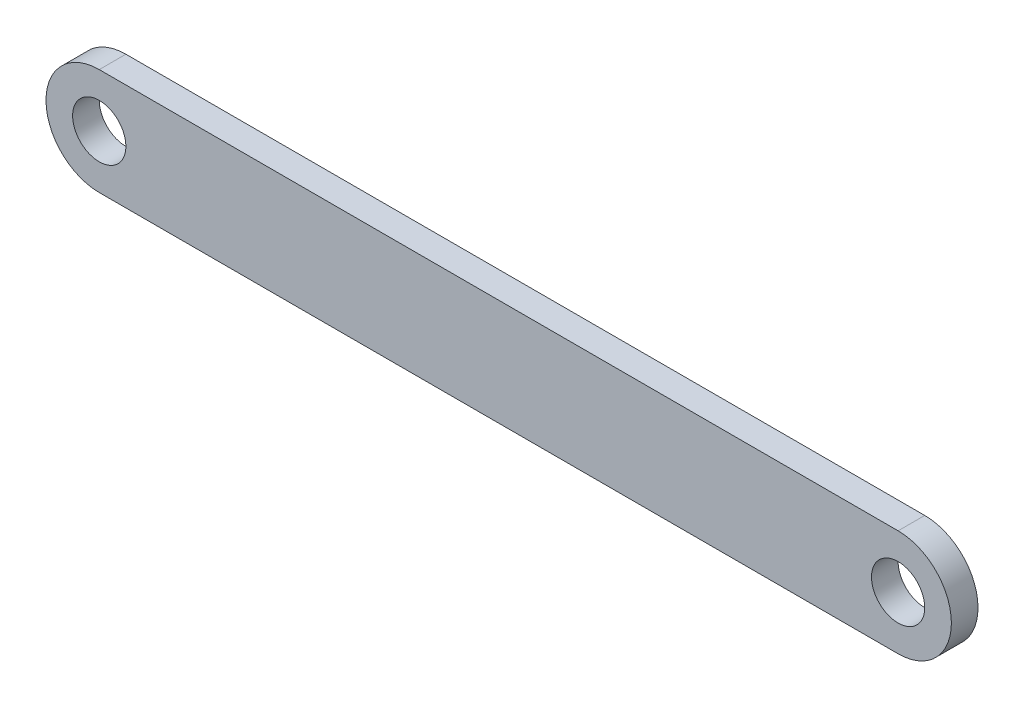
ISO-10303-21;
HEADER;
FILE_DESCRIPTION(('STEP AP214'),'2;1');
FILE_NAME('part.step','',(''),(''),'','','');
FILE_SCHEMA(('AUTOMOTIVE_DESIGN { 1 0 10303 214 1 1 1 1 }'));
ENDSEC;
DATA;
#1=APPLICATION_CONTEXT('core data for automotive mechanical design processes');
#2=APPLICATION_PROTOCOL_DEFINITION('international standard','automotive_design',2000,#1);
#3=PRODUCT_CONTEXT('',#1,'mechanical');
#4=PRODUCT('Part','Part','',(#3));
#5=PRODUCT_RELATED_PRODUCT_CATEGORY('part','',(#4));
#6=PRODUCT_DEFINITION_FORMATION('','',#4);
#7=PRODUCT_DEFINITION_CONTEXT('part definition',#1,'design');
#8=PRODUCT_DEFINITION('design','',#6,#7);
#9=PRODUCT_DEFINITION_SHAPE('','',#8);
#10=(LENGTH_UNIT() NAMED_UNIT(*) SI_UNIT(.MILLI.,.METRE.));
#11=(NAMED_UNIT(*) PLANE_ANGLE_UNIT() SI_UNIT($,.RADIAN.));
#12=(NAMED_UNIT(*) SI_UNIT($,.STERADIAN.) SOLID_ANGLE_UNIT());
#13=UNCERTAINTY_MEASURE_WITH_UNIT(LENGTH_MEASURE(1.E-05),#10,'distance_accuracy_value','');
#14=(GEOMETRIC_REPRESENTATION_CONTEXT(3) GLOBAL_UNCERTAINTY_ASSIGNED_CONTEXT((#13)) GLOBAL_UNIT_ASSIGNED_CONTEXT((#10,
#11,#12)) REPRESENTATION_CONTEXT('',''));
#15=CARTESIAN_POINT('',(0.,0.,0.));
#16=DIRECTION('',(0.,0.,1.));
#17=DIRECTION('',(1.,0.,0.));
#18=AXIS2_PLACEMENT_3D('',#15,#16,#17);
#19=CARTESIAN_POINT('',(-102.884615384615,19.2307692307692,5.));
#20=DIRECTION('',(0.,0.,1.));
#21=DIRECTION('',(1.,0.,0.));
#22=AXIS2_PLACEMENT_3D('',#19,#20,#21);
#23=PLANE('',#22);
#24=CARTESIAN_POINT('',(-102.884615384615,19.2307692307692,5.));
#25=DIRECTION('',(0.,0.,1.));
#26=DIRECTION('',(1.,0.,0.));
#27=AXIS2_PLACEMENT_3D('',#24,#25,#26);
#28=CIRCLE('',#27,5.);
#29=CARTESIAN_POINT('',(-97.8846153846154,19.2307692307692,5.));
#30=VERTEX_POINT('',#29);
#31=EDGE_CURVE('E108',#30,#30,#28,.T.);
#32=ORIENTED_EDGE('',*,*,#31,.F.);
#33=EDGE_LOOP('',(#32));
#34=FACE_BOUND('',#33,.T.);
#35=CARTESIAN_POINT('',(-102.884615384615,19.2307692307692,5.));
#36=DIRECTION('',(0.,0.,1.));
#37=DIRECTION('',(1.,0.,0.));
#38=AXIS2_PLACEMENT_3D('',#35,#36,#37);
#39=CIRCLE('',#38,10.);
#40=CARTESIAN_POINT('',(-102.884615384615,29.2307692307692,5.));
#41=VERTEX_POINT('',#40);
#42=CARTESIAN_POINT('',(-102.884615384615,9.23076923076923,5.));
#43=VERTEX_POINT('',#42);
#44=EDGE_CURVE('E93',#41,#43,#39,.T.);
#45=ORIENTED_EDGE('',*,*,#44,.T.);
#46=DIRECTION('',(1.,0.,0.));
#47=VECTOR('',#46,1.);
#48=CARTESIAN_POINT('',(-102.884615384615,9.23076923076923,5.));
#49=LINE('',#48,#47);
#50=CARTESIAN_POINT('',(47.1153846153846,9.23076923076923,5.));
#51=VERTEX_POINT('',#50);
#52=EDGE_CURVE('E88',#43,#51,#49,.T.);
#53=ORIENTED_EDGE('',*,*,#52,.T.);
#54=CARTESIAN_POINT('',(47.1153846153846,19.2307692307692,5.));
#55=DIRECTION('',(0.,0.,1.));
#56=DIRECTION('',(1.,0.,0.));
#57=AXIS2_PLACEMENT_3D('',#54,#55,#56);
#58=CIRCLE('',#57,10.);
#59=CARTESIAN_POINT('',(47.1153846153846,29.2307692307692,5.));
#60=VERTEX_POINT('',#59);
#61=EDGE_CURVE('E91',#51,#60,#58,.T.);
#62=ORIENTED_EDGE('',*,*,#61,.T.);
#63=DIRECTION('',(-1.,0.,0.));
#64=VECTOR('',#63,1.);
#65=CARTESIAN_POINT('',(-102.884615384615,29.2307692307692,5.));
#66=LINE('',#65,#64);
#67=EDGE_CURVE('E58',#60,#41,#66,.T.);
#68=ORIENTED_EDGE('',*,*,#67,.T.);
#69=EDGE_LOOP('',(#45,#53,#62,#68));
#70=FACE_BOUND('',#69,.T.);
#71=CARTESIAN_POINT('',(47.1153846153846,19.2307692307692,5.));
#72=DIRECTION('',(0.,0.,1.));
#73=DIRECTION('',(1.,0.,0.));
#74=AXIS2_PLACEMENT_3D('',#71,#72,#73);
#75=CIRCLE('',#74,5.);
#76=CARTESIAN_POINT('',(52.1153846153846,19.2307692307692,5.));
#77=VERTEX_POINT('',#76);
#78=EDGE_CURVE('E123',#77,#77,#75,.T.);
#79=ORIENTED_EDGE('',*,*,#78,.F.);
#80=EDGE_LOOP('',(#79));
#81=FACE_BOUND('',#80,.T.);
#82=ADVANCED_FACE('F41',(#34,#70,#81),#23,.T.);
#83=CARTESIAN_POINT('',(-102.884615384615,19.2307692307692,0.));
#84=DIRECTION('',(0.,0.,1.));
#85=DIRECTION('',(1.,0.,0.));
#86=AXIS2_PLACEMENT_3D('',#83,#84,#85);
#87=PLANE('',#86);
#88=CARTESIAN_POINT('',(-102.884615384615,19.2307692307692,0.));
#89=DIRECTION('',(0.,0.,1.));
#90=DIRECTION('',(1.,0.,0.));
#91=AXIS2_PLACEMENT_3D('',#88,#89,#90);
#92=CIRCLE('',#91,10.);
#93=CARTESIAN_POINT('',(-102.884615384615,29.2307692307692,0.));
#94=VERTEX_POINT('',#93);
#95=CARTESIAN_POINT('',(-102.884615384615,9.23076923076923,0.));
#96=VERTEX_POINT('',#95);
#97=EDGE_CURVE('E105',#94,#96,#92,.T.);
#98=ORIENTED_EDGE('',*,*,#97,.F.);
#99=DIRECTION('',(-1.,0.,0.));
#100=VECTOR('',#99,1.);
#101=CARTESIAN_POINT('',(-102.884615384615,29.2307692307692,0.));
#102=LINE('',#101,#100);
#103=CARTESIAN_POINT('',(47.1153846153846,29.2307692307692,0.));
#104=VERTEX_POINT('',#103);
#105=EDGE_CURVE('E81',#104,#94,#102,.T.);
#106=ORIENTED_EDGE('',*,*,#105,.F.);
#107=CARTESIAN_POINT('',(47.1153846153846,19.2307692307692,0.));
#108=DIRECTION('',(0.,0.,1.));
#109=DIRECTION('',(1.,0.,0.));
#110=AXIS2_PLACEMENT_3D('',#107,#108,#109);
#111=CIRCLE('',#110,10.);
#112=CARTESIAN_POINT('',(47.1153846153846,9.23076923076923,0.));
#113=VERTEX_POINT('',#112);
#114=EDGE_CURVE('E75',#113,#104,#111,.T.);
#115=ORIENTED_EDGE('',*,*,#114,.F.);
#116=DIRECTION('',(1.,0.,0.));
#117=VECTOR('',#116,1.);
#118=CARTESIAN_POINT('',(-102.884615384615,9.23076923076923,0.));
#119=LINE('',#118,#117);
#120=EDGE_CURVE('E97',#96,#113,#119,.T.);
#121=ORIENTED_EDGE('',*,*,#120,.F.);
#122=EDGE_LOOP('',(#98,#106,#115,#121));
#123=FACE_BOUND('',#122,.T.);
#124=CARTESIAN_POINT('',(-102.884615384615,19.2307692307692,0.));
#125=DIRECTION('',(0.,0.,1.));
#126=DIRECTION('',(1.,0.,0.));
#127=AXIS2_PLACEMENT_3D('',#124,#125,#126);
#128=CIRCLE('',#127,5.);
#129=CARTESIAN_POINT('',(-97.8846153846154,19.2307692307692,0.));
#130=VERTEX_POINT('',#129);
#131=EDGE_CURVE('E120',#130,#130,#128,.T.);
#132=ORIENTED_EDGE('',*,*,#131,.T.);
#133=EDGE_LOOP('',(#132));
#134=FACE_BOUND('',#133,.T.);
#135=CARTESIAN_POINT('',(47.1153846153846,19.2307692307692,0.));
#136=DIRECTION('',(0.,0.,1.));
#137=DIRECTION('',(1.,0.,0.));
#138=AXIS2_PLACEMENT_3D('',#135,#136,#137);
#139=CIRCLE('',#138,5.);
#140=CARTESIAN_POINT('',(52.1153846153846,19.2307692307692,0.));
#141=VERTEX_POINT('',#140);
#142=EDGE_CURVE('E126',#141,#141,#139,.T.);
#143=ORIENTED_EDGE('',*,*,#142,.T.);
#144=EDGE_LOOP('',(#143));
#145=FACE_BOUND('',#144,.T.);
#146=ADVANCED_FACE('F116',(#123,#134,#145),#87,.F.);
#147=CARTESIAN_POINT('',(-102.884615384615,19.2307692307692,5.));
#148=DIRECTION('',(0.,0.,-1.));
#149=DIRECTION('',(-1.,0.,0.));
#150=AXIS2_PLACEMENT_3D('',#147,#148,#149);
#151=CYLINDRICAL_SURFACE('',#150,10.);
#152=ORIENTED_EDGE('',*,*,#97,.T.);
#153=DIRECTION('',(0.,0.,-1.));
#154=VECTOR('',#153,1.);
#155=CARTESIAN_POINT('',(-102.884615384615,9.23076923076923,5.));
#156=LINE('',#155,#154);
#157=EDGE_CURVE('E11',#43,#96,#156,.T.);
#158=ORIENTED_EDGE('',*,*,#157,.F.);
#159=ORIENTED_EDGE('',*,*,#44,.F.);
#160=DIRECTION('',(0.,0.,-1.));
#161=VECTOR('',#160,1.);
#162=CARTESIAN_POINT('',(-102.884615384615,29.2307692307692,5.));
#163=LINE('',#162,#161);
#164=EDGE_CURVE('E101',#41,#94,#163,.T.);
#165=ORIENTED_EDGE('',*,*,#164,.T.);
#166=EDGE_LOOP('',(#152,#158,#159,#165));
#167=FACE_BOUND('',#166,.T.);
#168=ADVANCED_FACE('F43',(#167),#151,.T.);
#169=CARTESIAN_POINT('',(-102.884615384615,9.23076923076923,5.));
#170=DIRECTION('',(0.,1.,0.));
#171=DIRECTION('',(-1.,0.,0.));
#172=AXIS2_PLACEMENT_3D('',#169,#170,#171);
#173=PLANE('',#172);
#174=ORIENTED_EDGE('',*,*,#120,.T.);
#175=DIRECTION('',(0.,0.,-1.));
#176=VECTOR('',#175,1.);
#177=CARTESIAN_POINT('',(47.1153846153846,9.23076923076923,5.));
#178=LINE('',#177,#176);
#179=EDGE_CURVE('E50',#51,#113,#178,.T.);
#180=ORIENTED_EDGE('',*,*,#179,.F.);
#181=ORIENTED_EDGE('',*,*,#52,.F.);
#182=ORIENTED_EDGE('',*,*,#157,.T.);
#183=EDGE_LOOP('',(#174,#180,#181,#182));
#184=FACE_BOUND('',#183,.T.);
#185=ADVANCED_FACE('F96',(#184),#173,.F.);
#186=CARTESIAN_POINT('',(47.1153846153846,19.2307692307692,5.));
#187=DIRECTION('',(0.,0.,-1.));
#188=DIRECTION('',(-1.,0.,0.));
#189=AXIS2_PLACEMENT_3D('',#186,#187,#188);
#190=CYLINDRICAL_SURFACE('',#189,10.);
#191=ORIENTED_EDGE('',*,*,#114,.T.);
#192=DIRECTION('',(0.,0.,-1.));
#193=VECTOR('',#192,1.);
#194=CARTESIAN_POINT('',(47.1153846153846,29.2307692307692,5.));
#195=LINE('',#194,#193);
#196=EDGE_CURVE('E98',#60,#104,#195,.T.);
#197=ORIENTED_EDGE('',*,*,#196,.F.);
#198=ORIENTED_EDGE('',*,*,#61,.F.);
#199=ORIENTED_EDGE('',*,*,#179,.T.);
#200=EDGE_LOOP('',(#191,#197,#198,#199));
#201=FACE_BOUND('',#200,.T.);
#202=ADVANCED_FACE('F99',(#201),#190,.T.);
#203=CARTESIAN_POINT('',(-102.884615384615,29.2307692307692,5.));
#204=DIRECTION('',(0.,-1.,0.));
#205=DIRECTION('',(0.,0.,-1.));
#206=AXIS2_PLACEMENT_3D('',#203,#204,#205);
#207=PLANE('',#206);
#208=ORIENTED_EDGE('',*,*,#105,.T.);
#209=ORIENTED_EDGE('',*,*,#164,.F.);
#210=ORIENTED_EDGE('',*,*,#67,.F.);
#211=ORIENTED_EDGE('',*,*,#196,.T.);
#212=EDGE_LOOP('',(#208,#209,#210,#211));
#213=FACE_BOUND('',#212,.T.);
#214=ADVANCED_FACE('F113',(#213),#207,.F.);
#215=CARTESIAN_POINT('',(-102.884615384615,19.2307692307692,5.));
#216=DIRECTION('',(0.,0.,-1.));
#217=DIRECTION('',(-1.,0.,0.));
#218=AXIS2_PLACEMENT_3D('',#215,#216,#217);
#219=CYLINDRICAL_SURFACE('',#218,5.);
#220=ORIENTED_EDGE('',*,*,#31,.T.);
#221=EDGE_LOOP('',(#220));
#222=FACE_BOUND('',#221,.T.);
#223=ORIENTED_EDGE('',*,*,#131,.F.);
#224=EDGE_LOOP('',(#223));
#225=FACE_BOUND('',#224,.T.);
#226=ADVANCED_FACE('F143',(#222,#225),#219,.F.);
#227=CARTESIAN_POINT('',(47.1153846153846,19.2307692307692,5.));
#228=DIRECTION('',(0.,0.,-1.));
#229=DIRECTION('',(-1.,0.,0.));
#230=AXIS2_PLACEMENT_3D('',#227,#228,#229);
#231=CYLINDRICAL_SURFACE('',#230,5.);
#232=ORIENTED_EDGE('',*,*,#78,.T.);
#233=EDGE_LOOP('',(#232));
#234=FACE_BOUND('',#233,.T.);
#235=ORIENTED_EDGE('',*,*,#142,.F.);
#236=EDGE_LOOP('',(#235));
#237=FACE_BOUND('',#236,.T.);
#238=ADVANCED_FACE('F132',(#234,#237),#231,.F.);
#239=CLOSED_SHELL('',(#82,#146,#168,#185,#202,#214,#226,#238));
#240=MANIFOLD_SOLID_BREP('B2',#239);
#241=ADVANCED_BREP_SHAPE_REPRESENTATION('',(#18,#240),#14);
#242=SHAPE_DEFINITION_REPRESENTATION(#9,#241);
ENDSEC;
END-ISO-10303-21;
